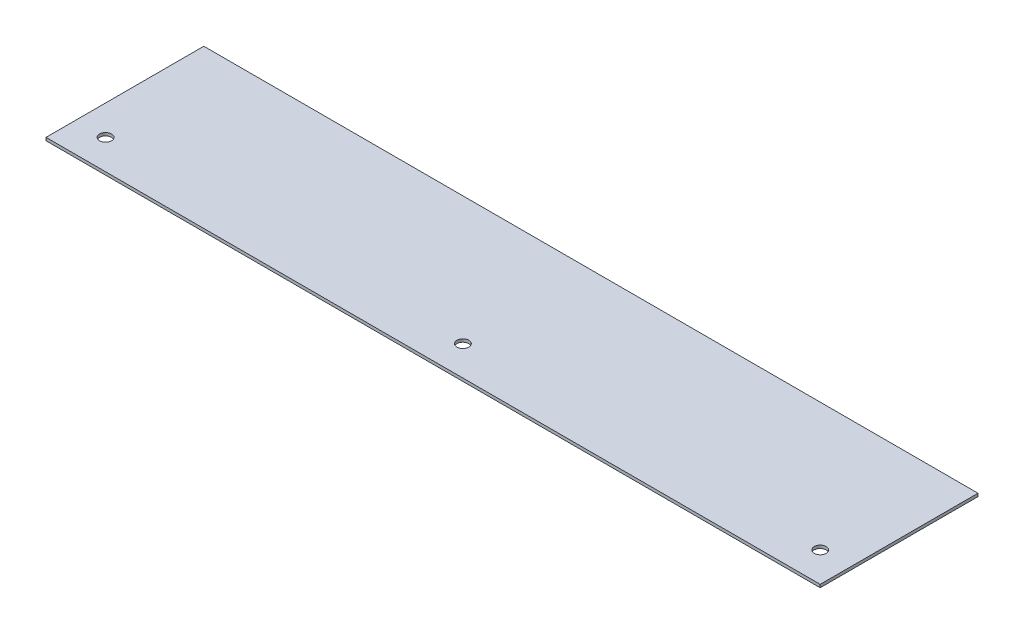
ISO-10303-21;
HEADER;
FILE_DESCRIPTION(('STEP AP214'),'2;1');
FILE_NAME('part.step','',(''),(''),'','','');
FILE_SCHEMA(('AUTOMOTIVE_DESIGN { 1 0 10303 214 1 1 1 1 }'));
ENDSEC;
DATA;
#1=APPLICATION_CONTEXT('core data for automotive mechanical design processes');
#2=APPLICATION_PROTOCOL_DEFINITION('international standard','automotive_design',2000,#1);
#3=PRODUCT_CONTEXT('',#1,'mechanical');
#4=PRODUCT('Part','Part','',(#3));
#5=PRODUCT_RELATED_PRODUCT_CATEGORY('part','',(#4));
#6=PRODUCT_DEFINITION_FORMATION('','',#4);
#7=PRODUCT_DEFINITION_CONTEXT('part definition',#1,'design');
#8=PRODUCT_DEFINITION('design','',#6,#7);
#9=PRODUCT_DEFINITION_SHAPE('','',#8);
#10=(LENGTH_UNIT() NAMED_UNIT(*) SI_UNIT(.MILLI.,.METRE.));
#11=(NAMED_UNIT(*) PLANE_ANGLE_UNIT() SI_UNIT($,.RADIAN.));
#12=(NAMED_UNIT(*) SI_UNIT($,.STERADIAN.) SOLID_ANGLE_UNIT());
#13=UNCERTAINTY_MEASURE_WITH_UNIT(LENGTH_MEASURE(1.E-05),#10,'distance_accuracy_value','');
#14=(GEOMETRIC_REPRESENTATION_CONTEXT(3) GLOBAL_UNCERTAINTY_ASSIGNED_CONTEXT((#13)) GLOBAL_UNIT_ASSIGNED_CONTEXT((#10,
#11,#12)) REPRESENTATION_CONTEXT('',''));
#15=CARTESIAN_POINT('',(0.,0.,0.));
#16=DIRECTION('',(0.,0.,1.));
#17=DIRECTION('',(1.,0.,0.));
#18=AXIS2_PLACEMENT_3D('',#15,#16,#17);
#19=CARTESIAN_POINT('',(130.,1.,0.));
#20=DIRECTION('',(1.,0.,0.));
#21=DIRECTION('',(0.,0.,-1.));
#22=AXIS2_PLACEMENT_3D('',#19,#20,#21);
#23=PLANE('',#22);
#24=DIRECTION('',(0.,0.,1.));
#25=VECTOR('',#24,1.);
#26=CARTESIAN_POINT('',(130.,0.,0.));
#27=LINE('',#26,#25);
#28=CARTESIAN_POINT('',(130.,0.,-43.));
#29=VERTEX_POINT('',#28);
#30=CARTESIAN_POINT('',(130.,0.,10.));
#31=VERTEX_POINT('',#30);
#32=EDGE_CURVE('E132',#29,#31,#27,.T.);
#33=ORIENTED_EDGE('',*,*,#32,.F.);
#34=DIRECTION('',(0.,-1.,0.));
#35=VECTOR('',#34,1.);
#36=CARTESIAN_POINT('',(130.,1.,-43.));
#37=LINE('',#36,#35);
#38=CARTESIAN_POINT('',(130.,1.,-43.));
#39=VERTEX_POINT('',#38);
#40=EDGE_CURVE('E11',#39,#29,#37,.T.);
#41=ORIENTED_EDGE('',*,*,#40,.F.);
#42=DIRECTION('',(0.,0.,1.));
#43=VECTOR('',#42,1.);
#44=CARTESIAN_POINT('',(130.,1.,0.));
#45=LINE('',#44,#43);
#46=CARTESIAN_POINT('',(130.,1.,10.));
#47=VERTEX_POINT('',#46);
#48=EDGE_CURVE('E110',#39,#47,#45,.T.);
#49=ORIENTED_EDGE('',*,*,#48,.T.);
#50=DIRECTION('',(0.,-1.,0.));
#51=VECTOR('',#50,1.);
#52=CARTESIAN_POINT('',(130.,1.,10.));
#53=LINE('',#52,#51);
#54=EDGE_CURVE('E86',#47,#31,#53,.T.);
#55=ORIENTED_EDGE('',*,*,#54,.T.);
#56=EDGE_LOOP('',(#33,#41,#49,#55));
#57=FACE_BOUND('',#56,.T.);
#58=ADVANCED_FACE('F43',(#57),#23,.T.);
#59=CARTESIAN_POINT('',(0.,1.,-43.));
#60=DIRECTION('',(0.,0.,-1.));
#61=DIRECTION('',(-1.,0.,0.));
#62=AXIS2_PLACEMENT_3D('',#59,#60,#61);
#63=PLANE('',#62);
#64=DIRECTION('',(1.,0.,0.));
#65=VECTOR('',#64,1.);
#66=CARTESIAN_POINT('',(0.,0.,-43.));
#67=LINE('',#66,#65);
#68=CARTESIAN_POINT('',(-130.,0.,-43.));
#69=VERTEX_POINT('',#68);
#70=EDGE_CURVE('E99',#69,#29,#67,.T.);
#71=ORIENTED_EDGE('',*,*,#70,.F.);
#72=DIRECTION('',(0.,-1.,0.));
#73=VECTOR('',#72,1.);
#74=CARTESIAN_POINT('',(-130.,1.,-43.));
#75=LINE('',#74,#73);
#76=CARTESIAN_POINT('',(-130.,1.,-43.));
#77=VERTEX_POINT('',#76);
#78=EDGE_CURVE('E52',#77,#69,#75,.T.);
#79=ORIENTED_EDGE('',*,*,#78,.F.);
#80=DIRECTION('',(1.,0.,0.));
#81=VECTOR('',#80,1.);
#82=CARTESIAN_POINT('',(0.,1.,-43.));
#83=LINE('',#82,#81);
#84=EDGE_CURVE('E97',#77,#39,#83,.T.);
#85=ORIENTED_EDGE('',*,*,#84,.T.);
#86=ORIENTED_EDGE('',*,*,#40,.T.);
#87=EDGE_LOOP('',(#71,#79,#85,#86));
#88=FACE_BOUND('',#87,.T.);
#89=ADVANCED_FACE('F95',(#88),#63,.T.);
#90=CARTESIAN_POINT('',(-130.,1.,0.));
#91=DIRECTION('',(1.,0.,0.));
#92=DIRECTION('',(0.,0.,-1.));
#93=AXIS2_PLACEMENT_3D('',#90,#91,#92);
#94=PLANE('',#93);
#95=DIRECTION('',(0.,0.,1.));
#96=VECTOR('',#95,1.);
#97=CARTESIAN_POINT('',(-130.,0.,0.));
#98=LINE('',#97,#96);
#99=CARTESIAN_POINT('',(-130.,0.,10.));
#100=VERTEX_POINT('',#99);
#101=EDGE_CURVE('E135',#69,#100,#98,.T.);
#102=ORIENTED_EDGE('',*,*,#101,.T.);
#103=DIRECTION('',(0.,-1.,0.));
#104=VECTOR('',#103,1.);
#105=CARTESIAN_POINT('',(-130.,1.,10.));
#106=LINE('',#105,#104);
#107=CARTESIAN_POINT('',(-130.,1.,10.));
#108=VERTEX_POINT('',#107);
#109=EDGE_CURVE('E103',#108,#100,#106,.T.);
#110=ORIENTED_EDGE('',*,*,#109,.F.);
#111=DIRECTION('',(0.,0.,1.));
#112=VECTOR('',#111,1.);
#113=CARTESIAN_POINT('',(-130.,1.,0.));
#114=LINE('',#113,#112);
#115=EDGE_CURVE('E105',#77,#108,#114,.T.);
#116=ORIENTED_EDGE('',*,*,#115,.F.);
#117=ORIENTED_EDGE('',*,*,#78,.T.);
#118=EDGE_LOOP('',(#102,#110,#116,#117));
#119=FACE_BOUND('',#118,.T.);
#120=ADVANCED_FACE('F106',(#119),#94,.F.);
#121=CARTESIAN_POINT('',(-120.,1.,0.));
#122=DIRECTION('',(0.,-1.,0.));
#123=DIRECTION('',(0.,0.,-1.));
#124=AXIS2_PLACEMENT_3D('',#121,#122,#123);
#125=CYLINDRICAL_SURFACE('',#124,2.);
#126=CARTESIAN_POINT('',(-120.,1.,0.));
#127=DIRECTION('',(0.,1.,0.));
#128=DIRECTION('',(0.,0.,1.));
#129=AXIS2_PLACEMENT_3D('',#126,#127,#128);
#130=CIRCLE('',#129,2.);
#131=CARTESIAN_POINT('',(-120.,1.,2.));
#132=VERTEX_POINT('',#131);
#133=EDGE_CURVE('E115',#132,#132,#130,.T.);
#134=ORIENTED_EDGE('',*,*,#133,.T.);
#135=EDGE_LOOP('',(#134));
#136=FACE_BOUND('',#135,.T.);
#137=CARTESIAN_POINT('',(-120.,0.,0.));
#138=DIRECTION('',(0.,1.,0.));
#139=DIRECTION('',(0.,0.,1.));
#140=AXIS2_PLACEMENT_3D('',#137,#138,#139);
#141=CIRCLE('',#140,2.);
#142=CARTESIAN_POINT('',(-120.,0.,2.));
#143=VERTEX_POINT('',#142);
#144=EDGE_CURVE('E128',#143,#143,#141,.T.);
#145=ORIENTED_EDGE('',*,*,#144,.F.);
#146=EDGE_LOOP('',(#145));
#147=FACE_BOUND('',#146,.T.);
#148=ADVANCED_FACE('F153',(#136,#147),#125,.F.);
#149=CARTESIAN_POINT('',(0.,1.,0.));
#150=DIRECTION('',(0.,-1.,0.));
#151=DIRECTION('',(0.,0.,-1.));
#152=AXIS2_PLACEMENT_3D('',#149,#150,#151);
#153=CYLINDRICAL_SURFACE('',#152,2.);
#154=CARTESIAN_POINT('',(0.,1.,0.));
#155=DIRECTION('',(0.,1.,0.));
#156=DIRECTION('',(0.,0.,1.));
#157=AXIS2_PLACEMENT_3D('',#154,#155,#156);
#158=CIRCLE('',#157,2.);
#159=CARTESIAN_POINT('',(0.,1.,2.));
#160=VERTEX_POINT('',#159);
#161=EDGE_CURVE('E166',#160,#160,#158,.T.);
#162=ORIENTED_EDGE('',*,*,#161,.T.);
#163=EDGE_LOOP('',(#162));
#164=FACE_BOUND('',#163,.T.);
#165=CARTESIAN_POINT('',(0.,0.,0.));
#166=DIRECTION('',(0.,1.,0.));
#167=DIRECTION('',(0.,0.,1.));
#168=AXIS2_PLACEMENT_3D('',#165,#166,#167);
#169=CIRCLE('',#168,2.);
#170=CARTESIAN_POINT('',(0.,0.,2.));
#171=VERTEX_POINT('',#170);
#172=EDGE_CURVE('E124',#171,#171,#169,.T.);
#173=ORIENTED_EDGE('',*,*,#172,.F.);
#174=EDGE_LOOP('',(#173));
#175=FACE_BOUND('',#174,.T.);
#176=ADVANCED_FACE('F155',(#164,#175),#153,.F.);
#177=CARTESIAN_POINT('',(120.,1.,0.));
#178=DIRECTION('',(0.,-1.,0.));
#179=DIRECTION('',(0.,0.,-1.));
#180=AXIS2_PLACEMENT_3D('',#177,#178,#179);
#181=CYLINDRICAL_SURFACE('',#180,2.);
#182=CARTESIAN_POINT('',(120.,1.,0.));
#183=DIRECTION('',(0.,1.,0.));
#184=DIRECTION('',(0.,0.,1.));
#185=AXIS2_PLACEMENT_3D('',#182,#183,#184);
#186=CIRCLE('',#185,2.);
#187=CARTESIAN_POINT('',(120.,1.,1.99999999999999));
#188=VERTEX_POINT('',#187);
#189=EDGE_CURVE('E139',#188,#188,#186,.T.);
#190=ORIENTED_EDGE('',*,*,#189,.T.);
#191=EDGE_LOOP('',(#190));
#192=FACE_BOUND('',#191,.T.);
#193=CARTESIAN_POINT('',(120.,0.,0.));
#194=DIRECTION('',(0.,1.,0.));
#195=DIRECTION('',(0.,0.,1.));
#196=AXIS2_PLACEMENT_3D('',#193,#194,#195);
#197=CIRCLE('',#196,2.);
#198=CARTESIAN_POINT('',(120.,0.,1.99999999999999));
#199=VERTEX_POINT('',#198);
#200=EDGE_CURVE('E121',#199,#199,#197,.T.);
#201=ORIENTED_EDGE('',*,*,#200,.F.);
#202=EDGE_LOOP('',(#201));
#203=FACE_BOUND('',#202,.T.);
#204=ADVANCED_FACE('F45',(#192,#203),#181,.F.);
#205=CARTESIAN_POINT('',(0.,1.,10.));
#206=DIRECTION('',(0.,0.,-1.));
#207=DIRECTION('',(-1.,0.,0.));
#208=AXIS2_PLACEMENT_3D('',#205,#206,#207);
#209=PLANE('',#208);
#210=DIRECTION('',(1.,0.,0.));
#211=VECTOR('',#210,1.);
#212=CARTESIAN_POINT('',(0.,0.,10.));
#213=LINE('',#212,#211);
#214=EDGE_CURVE('E79',#100,#31,#213,.T.);
#215=ORIENTED_EDGE('',*,*,#214,.T.);
#216=ORIENTED_EDGE('',*,*,#54,.F.);
#217=DIRECTION('',(1.,0.,0.));
#218=VECTOR('',#217,1.);
#219=CARTESIAN_POINT('',(0.,1.,10.));
#220=LINE('',#219,#218);
#221=EDGE_CURVE('E60',#108,#47,#220,.T.);
#222=ORIENTED_EDGE('',*,*,#221,.F.);
#223=ORIENTED_EDGE('',*,*,#109,.T.);
#224=EDGE_LOOP('',(#215,#216,#222,#223));
#225=FACE_BOUND('',#224,.T.);
#226=ADVANCED_FACE('F143',(#225),#209,.F.);
#227=CARTESIAN_POINT('',(0.,1.,0.));
#228=DIRECTION('',(0.,1.,0.));
#229=DIRECTION('',(0.,0.,1.));
#230=AXIS2_PLACEMENT_3D('',#227,#228,#229);
#231=PLANE('',#230);
#232=ORIENTED_EDGE('',*,*,#189,.F.);
#233=EDGE_LOOP('',(#232));
#234=FACE_BOUND('',#233,.T.);
#235=ORIENTED_EDGE('',*,*,#161,.F.);
#236=EDGE_LOOP('',(#235));
#237=FACE_BOUND('',#236,.T.);
#238=ORIENTED_EDGE('',*,*,#133,.F.);
#239=EDGE_LOOP('',(#238));
#240=FACE_BOUND('',#239,.T.);
#241=ORIENTED_EDGE('',*,*,#48,.F.);
#242=ORIENTED_EDGE('',*,*,#84,.F.);
#243=ORIENTED_EDGE('',*,*,#115,.T.);
#244=ORIENTED_EDGE('',*,*,#221,.T.);
#245=EDGE_LOOP('',(#241,#242,#243,#244));
#246=FACE_BOUND('',#245,.T.);
#247=ADVANCED_FACE('F109',(#234,#237,#240,#246),#231,.T.);
#248=CARTESIAN_POINT('',(0.,0.,0.));
#249=DIRECTION('',(0.,1.,0.));
#250=DIRECTION('',(0.,0.,1.));
#251=AXIS2_PLACEMENT_3D('',#248,#249,#250);
#252=PLANE('',#251);
#253=ORIENTED_EDGE('',*,*,#200,.T.);
#254=EDGE_LOOP('',(#253));
#255=FACE_BOUND('',#254,.T.);
#256=ORIENTED_EDGE('',*,*,#172,.T.);
#257=EDGE_LOOP('',(#256));
#258=FACE_BOUND('',#257,.T.);
#259=ORIENTED_EDGE('',*,*,#144,.T.);
#260=EDGE_LOOP('',(#259));
#261=FACE_BOUND('',#260,.T.);
#262=ORIENTED_EDGE('',*,*,#32,.T.);
#263=ORIENTED_EDGE('',*,*,#214,.F.);
#264=ORIENTED_EDGE('',*,*,#101,.F.);
#265=ORIENTED_EDGE('',*,*,#70,.T.);
#266=EDGE_LOOP('',(#262,#263,#264,#265));
#267=FACE_BOUND('',#266,.T.);
#268=ADVANCED_FACE('F144',(#255,#258,#261,#267),#252,.F.);
#269=CLOSED_SHELL('',(#58,#89,#120,#148,#176,#204,#226,#247,#268));
#270=MANIFOLD_SOLID_BREP('B2',#269);
#271=ADVANCED_BREP_SHAPE_REPRESENTATION('',(#18,#270),#14);
#272=SHAPE_DEFINITION_REPRESENTATION(#9,#271);
ENDSEC;
END-ISO-10303-21;
